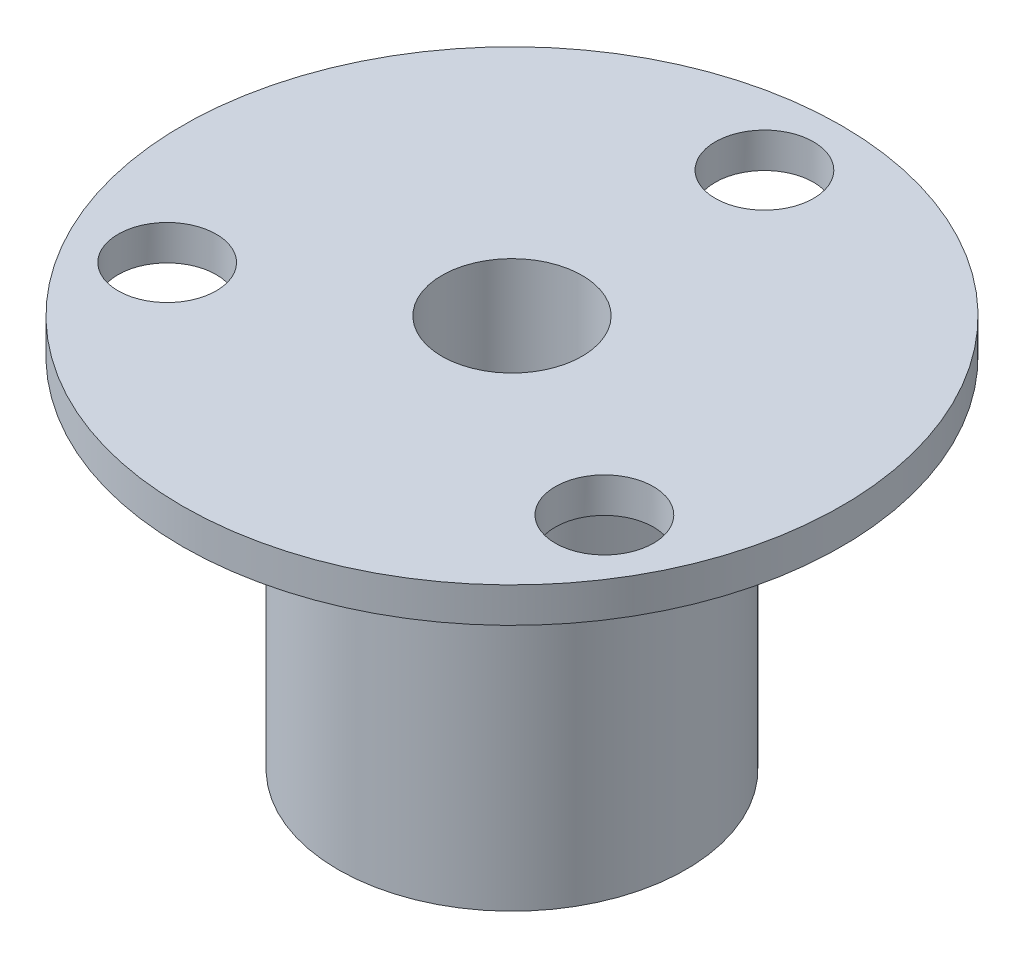
ISO-10303-21;
HEADER;
FILE_DESCRIPTION(('STEP AP214'),'2;1');
FILE_NAME('part.step','',(''),(''),'','','');
FILE_SCHEMA(('AUTOMOTIVE_DESIGN { 1 0 10303 214 1 1 1 1 }'));
ENDSEC;
DATA;
#1=APPLICATION_CONTEXT('core data for automotive mechanical design processes');
#2=APPLICATION_PROTOCOL_DEFINITION('international standard','automotive_design',2000,#1);
#3=PRODUCT_CONTEXT('',#1,'mechanical');
#4=PRODUCT('Part','Part','',(#3));
#5=PRODUCT_RELATED_PRODUCT_CATEGORY('part','',(#4));
#6=PRODUCT_DEFINITION_FORMATION('','',#4);
#7=PRODUCT_DEFINITION_CONTEXT('part definition',#1,'design');
#8=PRODUCT_DEFINITION('design','',#6,#7);
#9=PRODUCT_DEFINITION_SHAPE('','',#8);
#10=(LENGTH_UNIT() NAMED_UNIT(*) SI_UNIT(.MILLI.,.METRE.));
#11=(NAMED_UNIT(*) PLANE_ANGLE_UNIT() SI_UNIT($,.RADIAN.));
#12=(NAMED_UNIT(*) SI_UNIT($,.STERADIAN.) SOLID_ANGLE_UNIT());
#13=UNCERTAINTY_MEASURE_WITH_UNIT(LENGTH_MEASURE(1.E-05),#10,'distance_accuracy_value','');
#14=(GEOMETRIC_REPRESENTATION_CONTEXT(3) GLOBAL_UNCERTAINTY_ASSIGNED_CONTEXT((#13)) GLOBAL_UNIT_ASSIGNED_CONTEXT((#10,
#11,#12)) REPRESENTATION_CONTEXT('',''));
#15=CARTESIAN_POINT('',(0.,0.,0.));
#16=DIRECTION('',(0.,0.,1.));
#17=DIRECTION('',(1.,0.,0.));
#18=AXIS2_PLACEMENT_3D('',#15,#16,#17);
#19=CARTESIAN_POINT('',(2.,14.,0.));
#20=DIRECTION('',(0.,1.,0.));
#21=DIRECTION('',(0.,0.,1.));
#22=AXIS2_PLACEMENT_3D('',#19,#20,#21);
#23=PLANE('',#22);
#24=CARTESIAN_POINT('',(0.,14.,-9.));
#25=DIRECTION('',(0.,1.,0.));
#26=DIRECTION('',(0.,0.,1.));
#27=AXIS2_PLACEMENT_3D('',#24,#25,#26);
#28=CIRCLE('',#27,1.75);
#29=CARTESIAN_POINT('',(0.,14.,-7.25));
#30=VERTEX_POINT('',#29);
#31=EDGE_CURVE('E64',#30,#30,#28,.T.);
#32=ORIENTED_EDGE('',*,*,#31,.F.);
#33=EDGE_LOOP('',(#32));
#34=FACE_BOUND('',#33,.T.);
#35=CARTESIAN_POINT('',(7.79422863406106,14.,4.49999999999936));
#36=DIRECTION('',(0.,1.,0.));
#37=DIRECTION('',(0.,0.,1.));
#38=AXIS2_PLACEMENT_3D('',#35,#36,#37);
#39=CIRCLE('',#38,1.75);
#40=CARTESIAN_POINT('',(7.79422863406106,14.,6.24999999999936));
#41=VERTEX_POINT('',#40);
#42=EDGE_CURVE('E97',#41,#41,#39,.T.);
#43=ORIENTED_EDGE('',*,*,#42,.F.);
#44=EDGE_LOOP('',(#43));
#45=FACE_BOUND('',#44,.T.);
#46=CARTESIAN_POINT('',(-7.79422863405884,14.,4.50000000000064));
#47=DIRECTION('',(0.,1.,0.));
#48=DIRECTION('',(0.,0.,1.));
#49=AXIS2_PLACEMENT_3D('',#46,#47,#48);
#50=CIRCLE('',#49,1.75);
#51=CARTESIAN_POINT('',(-7.79422863405884,14.,6.25000000000064));
#52=VERTEX_POINT('',#51);
#53=EDGE_CURVE('E94',#52,#52,#50,.T.);
#54=ORIENTED_EDGE('',*,*,#53,.F.);
#55=EDGE_LOOP('',(#54));
#56=FACE_BOUND('',#55,.T.);
#57=CARTESIAN_POINT('',(0.,14.,0.));
#58=DIRECTION('',(0.,1.,0.));
#59=DIRECTION('',(0.,0.,1.));
#60=AXIS2_PLACEMENT_3D('',#57,#58,#59);
#61=CIRCLE('',#60,2.5);
#62=CARTESIAN_POINT('',(0.,14.,2.5));
#63=VERTEX_POINT('',#62);
#64=EDGE_CURVE('E60',#63,#63,#61,.T.);
#65=ORIENTED_EDGE('',*,*,#64,.F.);
#66=EDGE_LOOP('',(#65));
#67=FACE_BOUND('',#66,.T.);
#68=CARTESIAN_POINT('',(0.,14.,0.));
#69=DIRECTION('',(0.,-1.,0.));
#70=DIRECTION('',(0.,0.,-1.));
#71=AXIS2_PLACEMENT_3D('',#68,#69,#70);
#72=CIRCLE('',#71,11.75);
#73=CARTESIAN_POINT('',(0.,14.,-11.75));
#74=VERTEX_POINT('',#73);
#75=EDGE_CURVE('E10',#74,#74,#72,.T.);
#76=ORIENTED_EDGE('',*,*,#75,.F.);
#77=EDGE_LOOP('',(#76));
#78=FACE_BOUND('',#77,.T.);
#79=ADVANCED_FACE('F41',(#34,#45,#56,#67,#78),#23,.T.);
#80=CARTESIAN_POINT('',(0.,0.,0.));
#81=DIRECTION('',(0.,-1.,0.));
#82=DIRECTION('',(0.,0.,-1.));
#83=AXIS2_PLACEMENT_3D('',#80,#81,#82);
#84=CYLINDRICAL_SURFACE('',#83,11.75);
#85=ORIENTED_EDGE('',*,*,#75,.T.);
#86=EDGE_LOOP('',(#85));
#87=FACE_BOUND('',#86,.T.);
#88=CARTESIAN_POINT('',(0.,12.75,0.));
#89=DIRECTION('',(0.,-1.,0.));
#90=DIRECTION('',(0.,0.,-1.));
#91=AXIS2_PLACEMENT_3D('',#88,#89,#90);
#92=CIRCLE('',#91,11.75);
#93=CARTESIAN_POINT('',(0.,12.75,-11.75));
#94=VERTEX_POINT('',#93);
#95=EDGE_CURVE('E48',#94,#94,#92,.T.);
#96=ORIENTED_EDGE('',*,*,#95,.F.);
#97=EDGE_LOOP('',(#96));
#98=FACE_BOUND('',#97,.T.);
#99=ADVANCED_FACE('F78',(#87,#98),#84,.T.);
#100=CARTESIAN_POINT('',(11.75,12.75,0.));
#101=DIRECTION('',(0.,-1.,0.));
#102=DIRECTION('',(0.,0.,-1.));
#103=AXIS2_PLACEMENT_3D('',#100,#101,#102);
#104=PLANE('',#103);
#105=CARTESIAN_POINT('',(0.,12.75,-9.));
#106=DIRECTION('',(0.,-1.,0.));
#107=DIRECTION('',(0.,0.,-1.));
#108=AXIS2_PLACEMENT_3D('',#105,#106,#107);
#109=CIRCLE('',#108,1.75);
#110=CARTESIAN_POINT('',(0.,12.75,-10.75));
#111=VERTEX_POINT('',#110);
#112=EDGE_CURVE('E44',#111,#111,#109,.T.);
#113=ORIENTED_EDGE('',*,*,#112,.F.);
#114=EDGE_LOOP('',(#113));
#115=FACE_BOUND('',#114,.T.);
#116=CARTESIAN_POINT('',(7.79422863406106,12.75,4.49999999999936));
#117=DIRECTION('',(0.,-1.,0.));
#118=DIRECTION('',(0.,0.,-1.));
#119=AXIS2_PLACEMENT_3D('',#116,#117,#118);
#120=CIRCLE('',#119,1.75);
#121=CARTESIAN_POINT('',(7.79422863406106,12.75,2.74999999999936));
#122=VERTEX_POINT('',#121);
#123=EDGE_CURVE('E63',#122,#122,#120,.T.);
#124=ORIENTED_EDGE('',*,*,#123,.F.);
#125=EDGE_LOOP('',(#124));
#126=FACE_BOUND('',#125,.T.);
#127=CARTESIAN_POINT('',(-7.79422863405884,12.75,4.50000000000064));
#128=DIRECTION('',(0.,-1.,0.));
#129=DIRECTION('',(0.,0.,-1.));
#130=AXIS2_PLACEMENT_3D('',#127,#128,#129);
#131=CIRCLE('',#130,1.75);
#132=CARTESIAN_POINT('',(-7.79422863405884,12.75,2.75000000000064));
#133=VERTEX_POINT('',#132);
#134=EDGE_CURVE('E61',#133,#133,#131,.T.);
#135=ORIENTED_EDGE('',*,*,#134,.F.);
#136=EDGE_LOOP('',(#135));
#137=FACE_BOUND('',#136,.T.);
#138=ORIENTED_EDGE('',*,*,#95,.T.);
#139=EDGE_LOOP('',(#138));
#140=FACE_BOUND('',#139,.T.);
#141=CARTESIAN_POINT('',(0.,12.75,0.));
#142=DIRECTION('',(0.,-1.,0.));
#143=DIRECTION('',(0.,0.,-1.));
#144=AXIS2_PLACEMENT_3D('',#141,#142,#143);
#145=CIRCLE('',#144,6.2);
#146=CARTESIAN_POINT('',(0.,12.75,-6.2));
#147=VERTEX_POINT('',#146);
#148=EDGE_CURVE('E53',#147,#147,#145,.T.);
#149=ORIENTED_EDGE('',*,*,#148,.F.);
#150=EDGE_LOOP('',(#149));
#151=FACE_BOUND('',#150,.T.);
#152=ADVANCED_FACE('F74',(#115,#126,#137,#140,#151),#104,.T.);
#153=CARTESIAN_POINT('',(0.,0.,0.));
#154=DIRECTION('',(0.,-1.,0.));
#155=DIRECTION('',(0.,0.,-1.));
#156=AXIS2_PLACEMENT_3D('',#153,#154,#155);
#157=CYLINDRICAL_SURFACE('',#156,6.2);
#158=ORIENTED_EDGE('',*,*,#148,.T.);
#159=EDGE_LOOP('',(#158));
#160=FACE_BOUND('',#159,.T.);
#161=CARTESIAN_POINT('',(0.,0.,0.));
#162=DIRECTION('',(0.,-1.,0.));
#163=DIRECTION('',(0.,0.,-1.));
#164=AXIS2_PLACEMENT_3D('',#161,#162,#163);
#165=CIRCLE('',#164,6.2);
#166=CARTESIAN_POINT('',(0.,0.,-6.2));
#167=VERTEX_POINT('',#166);
#168=EDGE_CURVE('E88',#167,#167,#165,.T.);
#169=ORIENTED_EDGE('',*,*,#168,.F.);
#170=EDGE_LOOP('',(#169));
#171=FACE_BOUND('',#170,.T.);
#172=ADVANCED_FACE('F77',(#160,#171),#157,.T.);
#173=CARTESIAN_POINT('',(6.2,0.,0.));
#174=DIRECTION('',(0.,-1.,0.));
#175=DIRECTION('',(0.,0.,-1.));
#176=AXIS2_PLACEMENT_3D('',#173,#174,#175);
#177=PLANE('',#176);
#178=CARTESIAN_POINT('',(0.,0.,0.));
#179=DIRECTION('',(0.,-1.,0.));
#180=DIRECTION('',(0.,0.,-1.));
#181=AXIS2_PLACEMENT_3D('',#178,#179,#180);
#182=CIRCLE('',#181,2.5);
#183=CARTESIAN_POINT('',(0.,0.,-2.5));
#184=VERTEX_POINT('',#183);
#185=EDGE_CURVE('E57',#184,#184,#182,.T.);
#186=ORIENTED_EDGE('',*,*,#185,.F.);
#187=EDGE_LOOP('',(#186));
#188=FACE_BOUND('',#187,.T.);
#189=ORIENTED_EDGE('',*,*,#168,.T.);
#190=EDGE_LOOP('',(#189));
#191=FACE_BOUND('',#190,.T.);
#192=ADVANCED_FACE('F116',(#188,#191),#177,.T.);
#193=CARTESIAN_POINT('',(0.,-39.2,0.));
#194=DIRECTION('',(0.,1.,0.));
#195=DIRECTION('',(0.,0.,1.));
#196=AXIS2_PLACEMENT_3D('',#193,#194,#195);
#197=CYLINDRICAL_SURFACE('',#196,2.5);
#198=ORIENTED_EDGE('',*,*,#64,.T.);
#199=EDGE_LOOP('',(#198));
#200=FACE_BOUND('',#199,.T.);
#201=ORIENTED_EDGE('',*,*,#185,.T.);
#202=EDGE_LOOP('',(#201));
#203=FACE_BOUND('',#202,.T.);
#204=ADVANCED_FACE('F112',(#200,#203),#197,.F.);
#205=CARTESIAN_POINT('',(-7.79422863405884,4.,4.50000000000064));
#206=DIRECTION('',(0.,1.,0.));
#207=DIRECTION('',(0.,0.,1.));
#208=AXIS2_PLACEMENT_3D('',#205,#206,#207);
#209=CYLINDRICAL_SURFACE('',#208,1.75);
#210=ORIENTED_EDGE('',*,*,#134,.T.);
#211=EDGE_LOOP('',(#210));
#212=FACE_BOUND('',#211,.T.);
#213=ORIENTED_EDGE('',*,*,#53,.T.);
#214=EDGE_LOOP('',(#213));
#215=FACE_BOUND('',#214,.T.);
#216=ADVANCED_FACE('F115',(#212,#215),#209,.F.);
#217=CARTESIAN_POINT('',(7.79422863406106,4.,4.49999999999936));
#218=DIRECTION('',(0.,1.,0.));
#219=DIRECTION('',(0.,0.,1.));
#220=AXIS2_PLACEMENT_3D('',#217,#218,#219);
#221=CYLINDRICAL_SURFACE('',#220,1.75);
#222=ORIENTED_EDGE('',*,*,#123,.T.);
#223=EDGE_LOOP('',(#222));
#224=FACE_BOUND('',#223,.T.);
#225=ORIENTED_EDGE('',*,*,#42,.T.);
#226=EDGE_LOOP('',(#225));
#227=FACE_BOUND('',#226,.T.);
#228=ADVANCED_FACE('F169',(#224,#227),#221,.F.);
#229=CARTESIAN_POINT('',(0.,4.,-9.));
#230=DIRECTION('',(0.,1.,0.));
#231=DIRECTION('',(0.,0.,1.));
#232=AXIS2_PLACEMENT_3D('',#229,#230,#231);
#233=CYLINDRICAL_SURFACE('',#232,1.75);
#234=ORIENTED_EDGE('',*,*,#112,.T.);
#235=EDGE_LOOP('',(#234));
#236=FACE_BOUND('',#235,.T.);
#237=ORIENTED_EDGE('',*,*,#31,.T.);
#238=EDGE_LOOP('',(#237));
#239=FACE_BOUND('',#238,.T.);
#240=ADVANCED_FACE('F71',(#236,#239),#233,.F.);
#241=CLOSED_SHELL('',(#79,#99,#152,#172,#192,#204,#216,#228,#240));
#242=MANIFOLD_SOLID_BREP('B2',#241);
#243=ADVANCED_BREP_SHAPE_REPRESENTATION('',(#18,#242),#14);
#244=SHAPE_DEFINITION_REPRESENTATION(#9,#243);
ENDSEC;
END-ISO-10303-21;
